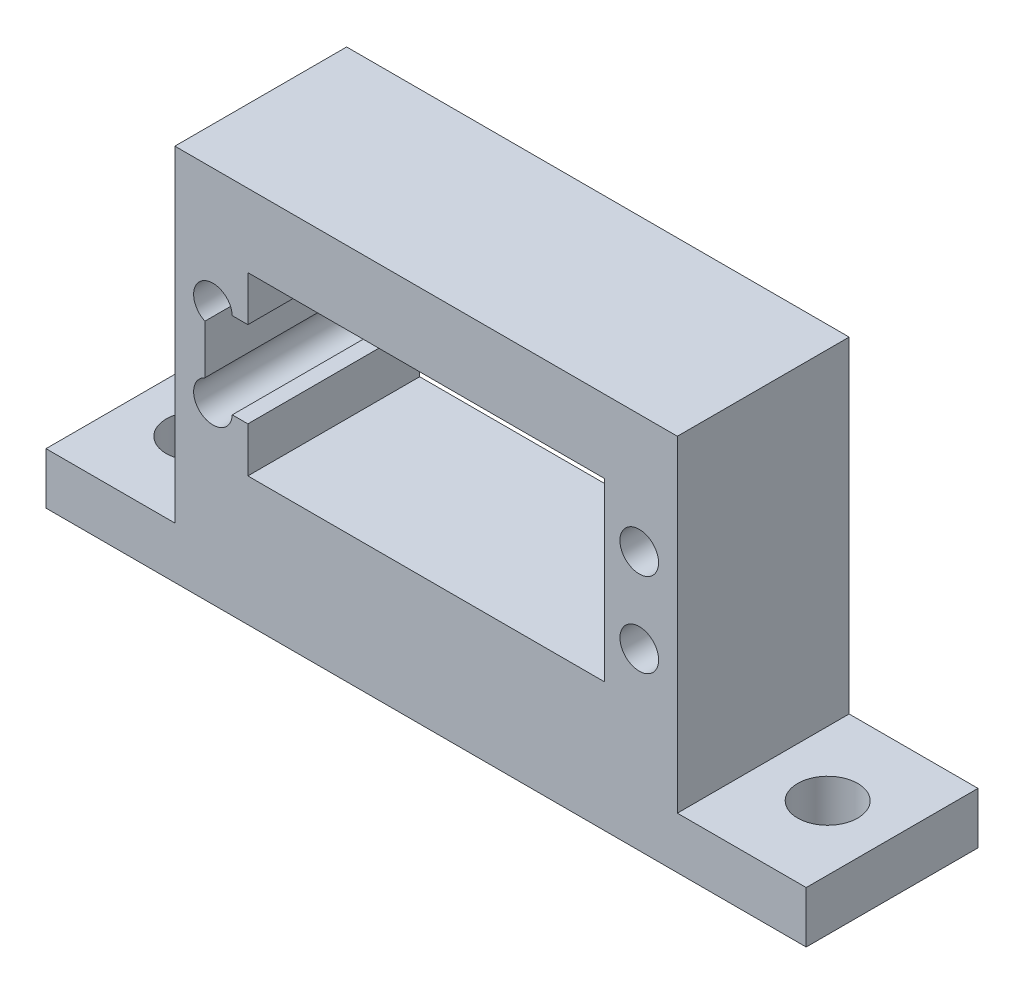
ISO-10303-21;
HEADER;
FILE_DESCRIPTION(('STEP AP214'),'2;1');
FILE_NAME('part.step','',(''),(''),'','','');
FILE_SCHEMA(('AUTOMOTIVE_DESIGN { 1 0 10303 214 1 1 1 1 }'));
ENDSEC;
DATA;
#1=APPLICATION_CONTEXT('core data for automotive mechanical design processes');
#2=APPLICATION_PROTOCOL_DEFINITION('international standard','automotive_design',2000,#1);
#3=PRODUCT_CONTEXT('',#1,'mechanical');
#4=PRODUCT('Part','Part','',(#3));
#5=PRODUCT_RELATED_PRODUCT_CATEGORY('part','',(#4));
#6=PRODUCT_DEFINITION_FORMATION('','',#4);
#7=PRODUCT_DEFINITION_CONTEXT('part definition',#1,'design');
#8=PRODUCT_DEFINITION('design','',#6,#7);
#9=PRODUCT_DEFINITION_SHAPE('','',#8);
#10=(LENGTH_UNIT() NAMED_UNIT(*) SI_UNIT(.MILLI.,.METRE.));
#11=(NAMED_UNIT(*) PLANE_ANGLE_UNIT() SI_UNIT($,.RADIAN.));
#12=(NAMED_UNIT(*) SI_UNIT($,.STERADIAN.) SOLID_ANGLE_UNIT());
#13=UNCERTAINTY_MEASURE_WITH_UNIT(LENGTH_MEASURE(1.E-05),#10,'distance_accuracy_value','');
#14=(GEOMETRIC_REPRESENTATION_CONTEXT(3) GLOBAL_UNCERTAINTY_ASSIGNED_CONTEXT((#13)) GLOBAL_UNIT_ASSIGNED_CONTEXT((#10,
#11,#12)) REPRESENTATION_CONTEXT('',''));
#15=CARTESIAN_POINT('',(0.,0.,0.));
#16=DIRECTION('',(0.,0.,1.));
#17=DIRECTION('',(1.,0.,0.));
#18=AXIS2_PLACEMENT_3D('',#15,#16,#17);
#19=CARTESIAN_POINT('',(0.,0.,20.));
#20=DIRECTION('',(0.,0.,1.));
#21=DIRECTION('',(1.,0.,0.));
#22=AXIS2_PLACEMENT_3D('',#19,#20,#21);
#23=PLANE('',#22);
#24=CARTESIAN_POINT('',(24.815,30.15,20.));
#25=DIRECTION('',(0.,0.,1.));
#26=DIRECTION('',(1.,0.,0.));
#27=AXIS2_PLACEMENT_3D('',#24,#25,#26);
#28=CIRCLE('',#27,2.25);
#29=CARTESIAN_POINT('',(27.065,30.15,20.));
#30=VERTEX_POINT('',#29);
#31=EDGE_CURVE('E204',#30,#30,#28,.T.);
#32=ORIENTED_EDGE('',*,*,#31,.F.);
#33=EDGE_LOOP('',(#32));
#34=FACE_BOUND('',#33,.T.);
#35=DIRECTION('',(0.,1.,0.));
#36=VECTOR('',#35,1.);
#37=CARTESIAN_POINT('',(44.25,0.,20.));
#38=LINE('',#37,#36);
#39=CARTESIAN_POINT('',(44.25,0.,20.));
#40=VERTEX_POINT('',#39);
#41=CARTESIAN_POINT('',(44.25,6.,20.));
#42=VERTEX_POINT('',#41);
#43=EDGE_CURVE('E244',#40,#42,#38,.T.);
#44=ORIENTED_EDGE('',*,*,#43,.T.);
#45=DIRECTION('',(-1.,0.,0.));
#46=VECTOR('',#45,1.);
#47=CARTESIAN_POINT('',(44.25,6.,20.));
#48=LINE('',#47,#46);
#49=CARTESIAN_POINT('',(29.25,5.99999999999999,20.));
#50=VERTEX_POINT('',#49);
#51=EDGE_CURVE('E247',#42,#50,#48,.T.);
#52=ORIENTED_EDGE('',*,*,#51,.T.);
#53=DIRECTION('',(0.,1.,0.));
#54=VECTOR('',#53,1.);
#55=CARTESIAN_POINT('',(29.25,5.99999999999999,20.));
#56=LINE('',#55,#54);
#57=CARTESIAN_POINT('',(29.25,44.,20.));
#58=VERTEX_POINT('',#57);
#59=EDGE_CURVE('E250',#50,#58,#56,.T.);
#60=ORIENTED_EDGE('',*,*,#59,.T.);
#61=DIRECTION('',(-1.,0.,0.));
#62=VECTOR('',#61,1.);
#63=CARTESIAN_POINT('',(29.25,44.,20.));
#64=LINE('',#63,#62);
#65=CARTESIAN_POINT('',(-29.25,44.,20.));
#66=VERTEX_POINT('',#65);
#67=EDGE_CURVE('E252',#58,#66,#64,.T.);
#68=ORIENTED_EDGE('',*,*,#67,.T.);
#69=DIRECTION('',(0.,-1.,0.));
#70=VECTOR('',#69,1.);
#71=CARTESIAN_POINT('',(-29.25,5.99999999999999,20.));
#72=LINE('',#71,#70);
#73=CARTESIAN_POINT('',(-29.25,5.99999999999999,20.));
#74=VERTEX_POINT('',#73);
#75=EDGE_CURVE('E254',#66,#74,#72,.T.);
#76=ORIENTED_EDGE('',*,*,#75,.T.);
#77=DIRECTION('',(-1.,0.,0.));
#78=VECTOR('',#77,1.);
#79=CARTESIAN_POINT('',(-44.25,6.,20.));
#80=LINE('',#79,#78);
#81=CARTESIAN_POINT('',(-44.25,6.,20.));
#82=VERTEX_POINT('',#81);
#83=EDGE_CURVE('E256',#74,#82,#80,.T.);
#84=ORIENTED_EDGE('',*,*,#83,.T.);
#85=DIRECTION('',(0.,-1.,0.));
#86=VECTOR('',#85,1.);
#87=CARTESIAN_POINT('',(-44.25,0.,20.));
#88=LINE('',#87,#86);
#89=CARTESIAN_POINT('',(-44.25,0.,20.));
#90=VERTEX_POINT('',#89);
#91=EDGE_CURVE('E258',#82,#90,#88,.T.);
#92=ORIENTED_EDGE('',*,*,#91,.T.);
#93=DIRECTION('',(1.,0.,0.));
#94=VECTOR('',#93,1.);
#95=CARTESIAN_POINT('',(-44.25,0.,20.));
#96=LINE('',#95,#94);
#97=EDGE_CURVE('E260',#90,#40,#96,.T.);
#98=ORIENTED_EDGE('',*,*,#97,.T.);
#99=EDGE_LOOP('',(#44,#52,#60,#68,#76,#84,#92,#98));
#100=FACE_BOUND('',#99,.T.);
#101=DIRECTION('',(-1.,0.,0.));
#102=VECTOR('',#101,1.);
#103=CARTESIAN_POINT('',(-20.75,30.25,20.));
#104=LINE('',#103,#102);
#105=CARTESIAN_POINT('',(-20.75,30.25,20.));
#106=VERTEX_POINT('',#105);
#107=CARTESIAN_POINT('',(-22.5672233207011,30.25,20.));
#108=VERTEX_POINT('',#107);
#109=EDGE_CURVE('E170',#106,#108,#104,.T.);
#110=ORIENTED_EDGE('',*,*,#109,.F.);
#111=DIRECTION('',(0.,-1.,0.));
#112=VECTOR('',#111,1.);
#113=CARTESIAN_POINT('',(-20.75,35.5,20.));
#114=LINE('',#113,#112);
#115=CARTESIAN_POINT('',(-20.75,35.5,20.));
#116=VERTEX_POINT('',#115);
#117=EDGE_CURVE('E162',#116,#106,#114,.T.);
#118=ORIENTED_EDGE('',*,*,#117,.F.);
#119=DIRECTION('',(-1.,0.,0.));
#120=VECTOR('',#119,1.);
#121=CARTESIAN_POINT('',(-20.75,35.5,20.));
#122=LINE('',#121,#120);
#123=CARTESIAN_POINT('',(20.75,35.5,20.));
#124=VERTEX_POINT('',#123);
#125=EDGE_CURVE('E201',#124,#116,#122,.T.);
#126=ORIENTED_EDGE('',*,*,#125,.F.);
#127=DIRECTION('',(0.,1.,0.));
#128=VECTOR('',#127,1.);
#129=CARTESIAN_POINT('',(20.75,35.5,20.));
#130=LINE('',#129,#128);
#131=CARTESIAN_POINT('',(20.75,15.,20.));
#132=VERTEX_POINT('',#131);
#133=EDGE_CURVE('E199',#132,#124,#130,.T.);
#134=ORIENTED_EDGE('',*,*,#133,.F.);
#135=DIRECTION('',(1.,0.,0.));
#136=VECTOR('',#135,1.);
#137=CARTESIAN_POINT('',(20.75,15.,20.));
#138=LINE('',#137,#136);
#139=CARTESIAN_POINT('',(-20.75,15.,20.));
#140=VERTEX_POINT('',#139);
#141=EDGE_CURVE('E197',#140,#132,#138,.T.);
#142=ORIENTED_EDGE('',*,*,#141,.F.);
#143=DIRECTION('',(0.,-1.,0.));
#144=VECTOR('',#143,1.);
#145=CARTESIAN_POINT('',(-20.75,20.25,20.));
#146=LINE('',#145,#144);
#147=CARTESIAN_POINT('',(-20.75,20.25,20.));
#148=VERTEX_POINT('',#147);
#149=EDGE_CURVE('E195',#148,#140,#146,.T.);
#150=ORIENTED_EDGE('',*,*,#149,.F.);
#151=DIRECTION('',(1.,0.,0.));
#152=VECTOR('',#151,1.);
#153=CARTESIAN_POINT('',(-22.5672233207011,20.25,20.));
#154=LINE('',#153,#152);
#155=CARTESIAN_POINT('',(-22.5672233207011,20.25,20.));
#156=VERTEX_POINT('',#155);
#157=EDGE_CURVE('E193',#156,#148,#154,.T.);
#158=ORIENTED_EDGE('',*,*,#157,.F.);
#159=CARTESIAN_POINT('',(-24.815,20.35,20.));
#160=DIRECTION('',(0.,0.,1.));
#161=DIRECTION('',(1.,0.,0.));
#162=AXIS2_PLACEMENT_3D('',#159,#160,#161);
#163=CIRCLE('',#162,2.25);
#164=CARTESIAN_POINT('',(-25.75,22.3965275468461,20.));
#165=VERTEX_POINT('',#164);
#166=EDGE_CURVE('E191',#165,#156,#163,.T.);
#167=ORIENTED_EDGE('',*,*,#166,.F.);
#168=DIRECTION('',(0.,-1.,0.));
#169=VECTOR('',#168,1.);
#170=CARTESIAN_POINT('',(-25.75,28.1034724531539,20.));
#171=LINE('',#170,#169);
#172=CARTESIAN_POINT('',(-25.75,28.1034724531539,20.));
#173=VERTEX_POINT('',#172);
#174=EDGE_CURVE('E186',#173,#165,#171,.T.);
#175=ORIENTED_EDGE('',*,*,#174,.F.);
#176=CARTESIAN_POINT('',(-24.815,30.15,20.));
#177=DIRECTION('',(0.,0.,1.));
#178=DIRECTION('',(-1.,0.,0.));
#179=AXIS2_PLACEMENT_3D('',#176,#177,#178);
#180=CIRCLE('',#179,2.25);
#181=EDGE_CURVE('E184',#108,#173,#180,.T.);
#182=ORIENTED_EDGE('',*,*,#181,.F.);
#183=EDGE_LOOP('',(#110,#118,#126,#134,#142,#150,#158,#167,#175,#182));
#184=FACE_BOUND('',#183,.T.);
#185=CARTESIAN_POINT('',(24.815,20.35,20.));
#186=DIRECTION('',(0.,0.,1.));
#187=DIRECTION('',(-1.,0.,0.));
#188=AXIS2_PLACEMENT_3D('',#185,#186,#187);
#189=CIRCLE('',#188,2.25);
#190=CARTESIAN_POINT('',(22.565,20.35,20.));
#191=VERTEX_POINT('',#190);
#192=EDGE_CURVE('E377',#191,#191,#189,.T.);
#193=ORIENTED_EDGE('',*,*,#192,.F.);
#194=EDGE_LOOP('',(#193));
#195=FACE_BOUND('',#194,.T.);
#196=ADVANCED_FACE('F37',(#34,#100,#184,#195),#23,.T.);
#197=CARTESIAN_POINT('',(0.,0.,0.));
#198=DIRECTION('',(0.,0.,1.));
#199=DIRECTION('',(1.,0.,0.));
#200=AXIS2_PLACEMENT_3D('',#197,#198,#199);
#201=PLANE('',#200);
#202=DIRECTION('',(0.,1.,0.));
#203=VECTOR('',#202,1.);
#204=CARTESIAN_POINT('',(44.25,0.,0.));
#205=LINE('',#204,#203);
#206=CARTESIAN_POINT('',(44.25,0.,0.));
#207=VERTEX_POINT('',#206);
#208=CARTESIAN_POINT('',(44.25,6.,0.));
#209=VERTEX_POINT('',#208);
#210=EDGE_CURVE('E178',#207,#209,#205,.T.);
#211=ORIENTED_EDGE('',*,*,#210,.F.);
#212=DIRECTION('',(1.,0.,0.));
#213=VECTOR('',#212,1.);
#214=CARTESIAN_POINT('',(-44.25,0.,0.));
#215=LINE('',#214,#213);
#216=CARTESIAN_POINT('',(-44.25,0.,0.));
#217=VERTEX_POINT('',#216);
#218=EDGE_CURVE('E248',#217,#207,#215,.T.);
#219=ORIENTED_EDGE('',*,*,#218,.F.);
#220=DIRECTION('',(0.,-1.,0.));
#221=VECTOR('',#220,1.);
#222=CARTESIAN_POINT('',(-44.25,0.,0.));
#223=LINE('',#222,#221);
#224=CARTESIAN_POINT('',(-44.25,6.,0.));
#225=VERTEX_POINT('',#224);
#226=EDGE_CURVE('E275',#225,#217,#223,.T.);
#227=ORIENTED_EDGE('',*,*,#226,.F.);
#228=DIRECTION('',(-1.,0.,0.));
#229=VECTOR('',#228,1.);
#230=CARTESIAN_POINT('',(-44.25,6.,0.));
#231=LINE('',#230,#229);
#232=CARTESIAN_POINT('',(-29.25,5.99999999999999,0.));
#233=VERTEX_POINT('',#232);
#234=EDGE_CURVE('E273',#233,#225,#231,.T.);
#235=ORIENTED_EDGE('',*,*,#234,.F.);
#236=DIRECTION('',(0.,-1.,0.));
#237=VECTOR('',#236,1.);
#238=CARTESIAN_POINT('',(-29.25,5.99999999999999,0.));
#239=LINE('',#238,#237);
#240=CARTESIAN_POINT('',(-29.25,44.,0.));
#241=VERTEX_POINT('',#240);
#242=EDGE_CURVE('E271',#241,#233,#239,.T.);
#243=ORIENTED_EDGE('',*,*,#242,.F.);
#244=DIRECTION('',(-1.,0.,0.));
#245=VECTOR('',#244,1.);
#246=CARTESIAN_POINT('',(29.25,44.,0.));
#247=LINE('',#246,#245);
#248=CARTESIAN_POINT('',(29.25,44.,0.));
#249=VERTEX_POINT('',#248);
#250=EDGE_CURVE('E269',#249,#241,#247,.T.);
#251=ORIENTED_EDGE('',*,*,#250,.F.);
#252=DIRECTION('',(0.,1.,0.));
#253=VECTOR('',#252,1.);
#254=CARTESIAN_POINT('',(29.25,5.99999999999999,0.));
#255=LINE('',#254,#253);
#256=CARTESIAN_POINT('',(29.25,5.99999999999999,0.));
#257=VERTEX_POINT('',#256);
#258=EDGE_CURVE('E267',#257,#249,#255,.T.);
#259=ORIENTED_EDGE('',*,*,#258,.F.);
#260=DIRECTION('',(-1.,0.,0.));
#261=VECTOR('',#260,1.);
#262=CARTESIAN_POINT('',(44.25,6.,0.));
#263=LINE('',#262,#261);
#264=EDGE_CURVE('E265',#209,#257,#263,.T.);
#265=ORIENTED_EDGE('',*,*,#264,.F.);
#266=EDGE_LOOP('',(#211,#219,#227,#235,#243,#251,#259,#265));
#267=FACE_BOUND('',#266,.T.);
#268=DIRECTION('',(0.,-1.,0.));
#269=VECTOR('',#268,1.);
#270=CARTESIAN_POINT('',(-20.75,35.5,0.));
#271=LINE('',#270,#269);
#272=CARTESIAN_POINT('',(-20.75,35.5,0.));
#273=VERTEX_POINT('',#272);
#274=CARTESIAN_POINT('',(-20.75,30.25,0.));
#275=VERTEX_POINT('',#274);
#276=EDGE_CURVE('E60',#273,#275,#271,.T.);
#277=ORIENTED_EDGE('',*,*,#276,.T.);
#278=DIRECTION('',(-1.,0.,0.));
#279=VECTOR('',#278,1.);
#280=CARTESIAN_POINT('',(-20.75,30.25,0.));
#281=LINE('',#280,#279);
#282=CARTESIAN_POINT('',(-22.5672233207011,30.25,0.));
#283=VERTEX_POINT('',#282);
#284=EDGE_CURVE('E177',#275,#283,#281,.T.);
#285=ORIENTED_EDGE('',*,*,#284,.T.);
#286=CARTESIAN_POINT('',(-24.815,30.15,0.));
#287=DIRECTION('',(0.,0.,1.));
#288=DIRECTION('',(-1.,0.,0.));
#289=AXIS2_PLACEMENT_3D('',#286,#287,#288);
#290=CIRCLE('',#289,2.25);
#291=CARTESIAN_POINT('',(-25.75,28.1034724531539,0.));
#292=VERTEX_POINT('',#291);
#293=EDGE_CURVE('E206',#283,#292,#290,.T.);
#294=ORIENTED_EDGE('',*,*,#293,.T.);
#295=DIRECTION('',(0.,-1.,0.));
#296=VECTOR('',#295,1.);
#297=CARTESIAN_POINT('',(-25.75,28.1034724531539,0.));
#298=LINE('',#297,#296);
#299=CARTESIAN_POINT('',(-25.75,22.3965275468461,0.));
#300=VERTEX_POINT('',#299);
#301=EDGE_CURVE('E209',#292,#300,#298,.T.);
#302=ORIENTED_EDGE('',*,*,#301,.T.);
#303=CARTESIAN_POINT('',(-24.815,20.35,0.));
#304=DIRECTION('',(0.,0.,1.));
#305=DIRECTION('',(1.,0.,0.));
#306=AXIS2_PLACEMENT_3D('',#303,#304,#305);
#307=CIRCLE('',#306,2.25);
#308=CARTESIAN_POINT('',(-22.5672233207011,20.25,0.));
#309=VERTEX_POINT('',#308);
#310=EDGE_CURVE('E212',#300,#309,#307,.T.);
#311=ORIENTED_EDGE('',*,*,#310,.T.);
#312=DIRECTION('',(1.,0.,0.));
#313=VECTOR('',#312,1.);
#314=CARTESIAN_POINT('',(-22.5672233207011,20.25,0.));
#315=LINE('',#314,#313);
#316=CARTESIAN_POINT('',(-20.75,20.25,0.));
#317=VERTEX_POINT('',#316);
#318=EDGE_CURVE('E215',#309,#317,#315,.T.);
#319=ORIENTED_EDGE('',*,*,#318,.T.);
#320=DIRECTION('',(0.,-1.,0.));
#321=VECTOR('',#320,1.);
#322=CARTESIAN_POINT('',(-20.75,20.25,0.));
#323=LINE('',#322,#321);
#324=CARTESIAN_POINT('',(-20.75,15.,0.));
#325=VERTEX_POINT('',#324);
#326=EDGE_CURVE('E218',#317,#325,#323,.T.);
#327=ORIENTED_EDGE('',*,*,#326,.T.);
#328=DIRECTION('',(1.,0.,0.));
#329=VECTOR('',#328,1.);
#330=CARTESIAN_POINT('',(20.75,15.,0.));
#331=LINE('',#330,#329);
#332=CARTESIAN_POINT('',(20.75,15.,0.));
#333=VERTEX_POINT('',#332);
#334=EDGE_CURVE('E221',#325,#333,#331,.T.);
#335=ORIENTED_EDGE('',*,*,#334,.T.);
#336=DIRECTION('',(0.,1.,0.));
#337=VECTOR('',#336,1.);
#338=CARTESIAN_POINT('',(20.75,35.5,0.));
#339=LINE('',#338,#337);
#340=CARTESIAN_POINT('',(20.75,35.5,0.));
#341=VERTEX_POINT('',#340);
#342=EDGE_CURVE('E224',#333,#341,#339,.T.);
#343=ORIENTED_EDGE('',*,*,#342,.T.);
#344=DIRECTION('',(-1.,0.,0.));
#345=VECTOR('',#344,1.);
#346=CARTESIAN_POINT('',(-20.75,35.5,0.));
#347=LINE('',#346,#345);
#348=EDGE_CURVE('E171',#341,#273,#347,.T.);
#349=ORIENTED_EDGE('',*,*,#348,.T.);
#350=EDGE_LOOP('',(#277,#285,#294,#302,#311,#319,#327,#335,#343,#349));
#351=FACE_BOUND('',#350,.T.);
#352=CARTESIAN_POINT('',(24.815,30.15,0.));
#353=DIRECTION('',(0.,0.,1.));
#354=DIRECTION('',(1.,0.,0.));
#355=AXIS2_PLACEMENT_3D('',#352,#353,#354);
#356=CIRCLE('',#355,2.25);
#357=CARTESIAN_POINT('',(27.065,30.15,0.));
#358=VERTEX_POINT('',#357);
#359=EDGE_CURVE('E380',#358,#358,#356,.T.);
#360=ORIENTED_EDGE('',*,*,#359,.T.);
#361=EDGE_LOOP('',(#360));
#362=FACE_BOUND('',#361,.T.);
#363=CARTESIAN_POINT('',(24.815,20.35,0.));
#364=DIRECTION('',(0.,0.,1.));
#365=DIRECTION('',(-1.,0.,0.));
#366=AXIS2_PLACEMENT_3D('',#363,#364,#365);
#367=CIRCLE('',#366,2.25);
#368=CARTESIAN_POINT('',(22.565,20.35,0.));
#369=VERTEX_POINT('',#368);
#370=EDGE_CURVE('E381',#369,#369,#367,.T.);
#371=ORIENTED_EDGE('',*,*,#370,.T.);
#372=EDGE_LOOP('',(#371));
#373=FACE_BOUND('',#372,.T.);
#374=ADVANCED_FACE('F305',(#267,#351,#362,#373),#201,.F.);
#375=CARTESIAN_POINT('',(44.25,0.,20.));
#376=DIRECTION('',(-1.,0.,0.));
#377=DIRECTION('',(0.,-1.,0.));
#378=AXIS2_PLACEMENT_3D('',#375,#376,#377);
#379=PLANE('',#378);
#380=ORIENTED_EDGE('',*,*,#210,.T.);
#381=DIRECTION('',(0.,0.,-1.));
#382=VECTOR('',#381,1.);
#383=CARTESIAN_POINT('',(44.25,6.,20.));
#384=LINE('',#383,#382);
#385=EDGE_CURVE('E11',#42,#209,#384,.T.);
#386=ORIENTED_EDGE('',*,*,#385,.F.);
#387=ORIENTED_EDGE('',*,*,#43,.F.);
#388=DIRECTION('',(0.,0.,-1.));
#389=VECTOR('',#388,1.);
#390=CARTESIAN_POINT('',(44.25,0.,20.));
#391=LINE('',#390,#389);
#392=EDGE_CURVE('E262',#40,#207,#391,.T.);
#393=ORIENTED_EDGE('',*,*,#392,.T.);
#394=EDGE_LOOP('',(#380,#386,#387,#393));
#395=FACE_BOUND('',#394,.T.);
#396=ADVANCED_FACE('F39',(#395),#379,.F.);
#397=CARTESIAN_POINT('',(44.25,6.,20.));
#398=DIRECTION('',(0.,-1.,0.));
#399=DIRECTION('',(1.,0.,0.));
#400=AXIS2_PLACEMENT_3D('',#397,#398,#399);
#401=PLANE('',#400);
#402=CARTESIAN_POINT('',(36.75,5.99999999999999,10.));
#403=DIRECTION('',(0.,1.,0.));
#404=DIRECTION('',(-1.,0.,0.));
#405=AXIS2_PLACEMENT_3D('',#402,#403,#404);
#406=CIRCLE('',#405,3.5);
#407=CARTESIAN_POINT('',(33.25,5.99999999999999,10.));
#408=VERTEX_POINT('',#407);
#409=EDGE_CURVE('E373',#408,#408,#406,.T.);
#410=ORIENTED_EDGE('',*,*,#409,.F.);
#411=EDGE_LOOP('',(#410));
#412=FACE_BOUND('',#411,.T.);
#413=ORIENTED_EDGE('',*,*,#264,.T.);
#414=DIRECTION('',(0.,0.,-1.));
#415=VECTOR('',#414,1.);
#416=CARTESIAN_POINT('',(29.25,5.99999999999999,20.));
#417=LINE('',#416,#415);
#418=EDGE_CURVE('E45',#50,#257,#417,.T.);
#419=ORIENTED_EDGE('',*,*,#418,.F.);
#420=ORIENTED_EDGE('',*,*,#51,.F.);
#421=ORIENTED_EDGE('',*,*,#385,.T.);
#422=EDGE_LOOP('',(#413,#419,#420,#421));
#423=FACE_BOUND('',#422,.T.);
#424=ADVANCED_FACE('F322',(#412,#423),#401,.F.);
#425=CARTESIAN_POINT('',(29.25,5.99999999999999,20.));
#426=DIRECTION('',(-1.,0.,0.));
#427=DIRECTION('',(0.,-1.,0.));
#428=AXIS2_PLACEMENT_3D('',#425,#426,#427);
#429=PLANE('',#428);
#430=ORIENTED_EDGE('',*,*,#258,.T.);
#431=DIRECTION('',(0.,0.,-1.));
#432=VECTOR('',#431,1.);
#433=CARTESIAN_POINT('',(29.25,44.,20.));
#434=LINE('',#433,#432);
#435=EDGE_CURVE('E292',#58,#249,#434,.T.);
#436=ORIENTED_EDGE('',*,*,#435,.F.);
#437=ORIENTED_EDGE('',*,*,#59,.F.);
#438=ORIENTED_EDGE('',*,*,#418,.T.);
#439=EDGE_LOOP('',(#430,#436,#437,#438));
#440=FACE_BOUND('',#439,.T.);
#441=ADVANCED_FACE('F299',(#440),#429,.F.);
#442=CARTESIAN_POINT('',(29.25,44.,20.));
#443=DIRECTION('',(0.,-1.,0.));
#444=DIRECTION('',(0.,0.,-1.));
#445=AXIS2_PLACEMENT_3D('',#442,#443,#444);
#446=PLANE('',#445);
#447=ORIENTED_EDGE('',*,*,#250,.T.);
#448=DIRECTION('',(0.,0.,-1.));
#449=VECTOR('',#448,1.);
#450=CARTESIAN_POINT('',(-29.25,44.,20.));
#451=LINE('',#450,#449);
#452=EDGE_CURVE('E289',#66,#241,#451,.T.);
#453=ORIENTED_EDGE('',*,*,#452,.F.);
#454=ORIENTED_EDGE('',*,*,#67,.F.);
#455=ORIENTED_EDGE('',*,*,#435,.T.);
#456=EDGE_LOOP('',(#447,#453,#454,#455));
#457=FACE_BOUND('',#456,.T.);
#458=ADVANCED_FACE('F311',(#457),#446,.F.);
#459=CARTESIAN_POINT('',(-29.25,5.99999999999999,20.));
#460=DIRECTION('',(1.,0.,0.));
#461=DIRECTION('',(0.,1.,0.));
#462=AXIS2_PLACEMENT_3D('',#459,#460,#461);
#463=PLANE('',#462);
#464=ORIENTED_EDGE('',*,*,#242,.T.);
#465=DIRECTION('',(0.,0.,-1.));
#466=VECTOR('',#465,1.);
#467=CARTESIAN_POINT('',(-29.25,5.99999999999999,20.));
#468=LINE('',#467,#466);
#469=EDGE_CURVE('E286',#74,#233,#468,.T.);
#470=ORIENTED_EDGE('',*,*,#469,.F.);
#471=ORIENTED_EDGE('',*,*,#75,.F.);
#472=ORIENTED_EDGE('',*,*,#452,.T.);
#473=EDGE_LOOP('',(#464,#470,#471,#472));
#474=FACE_BOUND('',#473,.T.);
#475=ADVANCED_FACE('F315',(#474),#463,.F.);
#476=CARTESIAN_POINT('',(-44.25,6.,20.));
#477=DIRECTION('',(0.,-1.,0.));
#478=DIRECTION('',(1.,0.,0.));
#479=AXIS2_PLACEMENT_3D('',#476,#477,#478);
#480=PLANE('',#479);
#481=CARTESIAN_POINT('',(-36.75,5.99999999999998,10.));
#482=DIRECTION('',(0.,1.,0.));
#483=DIRECTION('',(1.,0.,0.));
#484=AXIS2_PLACEMENT_3D('',#481,#482,#483);
#485=CIRCLE('',#484,3.5);
#486=CARTESIAN_POINT('',(-33.25,5.99999999999998,10.));
#487=VERTEX_POINT('',#486);
#488=EDGE_CURVE('E370',#487,#487,#485,.T.);
#489=ORIENTED_EDGE('',*,*,#488,.F.);
#490=EDGE_LOOP('',(#489));
#491=FACE_BOUND('',#490,.T.);
#492=ORIENTED_EDGE('',*,*,#234,.T.);
#493=DIRECTION('',(0.,0.,-1.));
#494=VECTOR('',#493,1.);
#495=CARTESIAN_POINT('',(-44.25,6.,20.));
#496=LINE('',#495,#494);
#497=EDGE_CURVE('E283',#82,#225,#496,.T.);
#498=ORIENTED_EDGE('',*,*,#497,.F.);
#499=ORIENTED_EDGE('',*,*,#83,.F.);
#500=ORIENTED_EDGE('',*,*,#469,.T.);
#501=EDGE_LOOP('',(#492,#498,#499,#500));
#502=FACE_BOUND('',#501,.T.);
#503=ADVANCED_FACE('F335',(#491,#502),#480,.F.);
#504=CARTESIAN_POINT('',(-44.25,0.,20.));
#505=DIRECTION('',(1.,0.,0.));
#506=DIRECTION('',(0.,1.,0.));
#507=AXIS2_PLACEMENT_3D('',#504,#505,#506);
#508=PLANE('',#507);
#509=ORIENTED_EDGE('',*,*,#226,.T.);
#510=DIRECTION('',(0.,0.,-1.));
#511=VECTOR('',#510,1.);
#512=CARTESIAN_POINT('',(-44.25,0.,20.));
#513=LINE('',#512,#511);
#514=EDGE_CURVE('E280',#90,#217,#513,.T.);
#515=ORIENTED_EDGE('',*,*,#514,.F.);
#516=ORIENTED_EDGE('',*,*,#91,.F.);
#517=ORIENTED_EDGE('',*,*,#497,.T.);
#518=EDGE_LOOP('',(#509,#515,#516,#517));
#519=FACE_BOUND('',#518,.T.);
#520=ADVANCED_FACE('F333',(#519),#508,.F.);
#521=CARTESIAN_POINT('',(-44.25,0.,20.));
#522=DIRECTION('',(0.,1.,0.));
#523=DIRECTION('',(-1.,0.,0.));
#524=AXIS2_PLACEMENT_3D('',#521,#522,#523);
#525=PLANE('',#524);
#526=CARTESIAN_POINT('',(36.75,0.,10.));
#527=DIRECTION('',(0.,1.,0.));
#528=DIRECTION('',(-1.,0.,0.));
#529=AXIS2_PLACEMENT_3D('',#526,#527,#528);
#530=CIRCLE('',#529,3.5);
#531=CARTESIAN_POINT('',(33.25,0.,10.));
#532=VERTEX_POINT('',#531);
#533=EDGE_CURVE('E365',#532,#532,#530,.T.);
#534=ORIENTED_EDGE('',*,*,#533,.T.);
#535=EDGE_LOOP('',(#534));
#536=FACE_BOUND('',#535,.T.);
#537=CARTESIAN_POINT('',(-36.75,0.,10.));
#538=DIRECTION('',(0.,1.,0.));
#539=DIRECTION('',(1.,0.,0.));
#540=AXIS2_PLACEMENT_3D('',#537,#538,#539);
#541=CIRCLE('',#540,3.5);
#542=CARTESIAN_POINT('',(-33.25,0.,10.));
#543=VERTEX_POINT('',#542);
#544=EDGE_CURVE('E368',#543,#543,#541,.T.);
#545=ORIENTED_EDGE('',*,*,#544,.T.);
#546=EDGE_LOOP('',(#545));
#547=FACE_BOUND('',#546,.T.);
#548=ORIENTED_EDGE('',*,*,#218,.T.);
#549=ORIENTED_EDGE('',*,*,#392,.F.);
#550=ORIENTED_EDGE('',*,*,#97,.F.);
#551=ORIENTED_EDGE('',*,*,#514,.T.);
#552=EDGE_LOOP('',(#548,#549,#550,#551));
#553=FACE_BOUND('',#552,.T.);
#554=ADVANCED_FACE('F328',(#536,#547,#553),#525,.F.);
#555=CARTESIAN_POINT('',(-20.75,35.5,20.));
#556=DIRECTION('',(1.,0.,0.));
#557=DIRECTION('',(0.,1.,0.));
#558=AXIS2_PLACEMENT_3D('',#555,#556,#557);
#559=PLANE('',#558);
#560=ORIENTED_EDGE('',*,*,#276,.F.);
#561=DIRECTION('',(0.,0.,-1.));
#562=VECTOR('',#561,1.);
#563=CARTESIAN_POINT('',(-20.75,35.5,20.));
#564=LINE('',#563,#562);
#565=EDGE_CURVE('E166',#116,#273,#564,.T.);
#566=ORIENTED_EDGE('',*,*,#565,.F.);
#567=ORIENTED_EDGE('',*,*,#117,.T.);
#568=DIRECTION('',(0.,0.,-1.));
#569=VECTOR('',#568,1.);
#570=CARTESIAN_POINT('',(-20.75,30.25,20.));
#571=LINE('',#570,#569);
#572=EDGE_CURVE('E165',#106,#275,#571,.T.);
#573=ORIENTED_EDGE('',*,*,#572,.T.);
#574=EDGE_LOOP('',(#560,#566,#567,#573));
#575=FACE_BOUND('',#574,.T.);
#576=ADVANCED_FACE('F164',(#575),#559,.T.);
#577=CARTESIAN_POINT('',(-20.75,30.25,20.));
#578=DIRECTION('',(0.,-1.,0.));
#579=DIRECTION('',(0.,0.,-1.));
#580=AXIS2_PLACEMENT_3D('',#577,#578,#579);
#581=PLANE('',#580);
#582=ORIENTED_EDGE('',*,*,#284,.F.);
#583=ORIENTED_EDGE('',*,*,#572,.F.);
#584=ORIENTED_EDGE('',*,*,#109,.T.);
#585=DIRECTION('',(0.,0.,-1.));
#586=VECTOR('',#585,1.);
#587=CARTESIAN_POINT('',(-22.5672233207011,30.25,20.));
#588=LINE('',#587,#586);
#589=EDGE_CURVE('E179',#108,#283,#588,.T.);
#590=ORIENTED_EDGE('',*,*,#589,.T.);
#591=EDGE_LOOP('',(#582,#583,#584,#590));
#592=FACE_BOUND('',#591,.T.);
#593=ADVANCED_FACE('F174',(#592),#581,.T.);
#594=CARTESIAN_POINT('',(-24.815,30.15,20.));
#595=DIRECTION('',(0.,0.,-1.));
#596=DIRECTION('',(-1.,0.,0.));
#597=AXIS2_PLACEMENT_3D('',#594,#595,#596);
#598=CYLINDRICAL_SURFACE('',#597,2.25);
#599=ORIENTED_EDGE('',*,*,#293,.F.);
#600=ORIENTED_EDGE('',*,*,#589,.F.);
#601=ORIENTED_EDGE('',*,*,#181,.T.);
#602=DIRECTION('',(0.,0.,-1.));
#603=VECTOR('',#602,1.);
#604=CARTESIAN_POINT('',(-25.75,28.1034724531539,20.));
#605=LINE('',#604,#603);
#606=EDGE_CURVE('E241',#173,#292,#605,.T.);
#607=ORIENTED_EDGE('',*,*,#606,.T.);
#608=EDGE_LOOP('',(#599,#600,#601,#607));
#609=FACE_BOUND('',#608,.T.);
#610=ADVANCED_FACE('F429',(#609),#598,.F.);
#611=CARTESIAN_POINT('',(-25.75,28.1034724531539,20.));
#612=DIRECTION('',(1.,0.,0.));
#613=DIRECTION('',(0.,0.,-1.));
#614=AXIS2_PLACEMENT_3D('',#611,#612,#613);
#615=PLANE('',#614);
#616=ORIENTED_EDGE('',*,*,#301,.F.);
#617=ORIENTED_EDGE('',*,*,#606,.F.);
#618=ORIENTED_EDGE('',*,*,#174,.T.);
#619=DIRECTION('',(0.,0.,-1.));
#620=VECTOR('',#619,1.);
#621=CARTESIAN_POINT('',(-25.75,22.3965275468461,20.));
#622=LINE('',#621,#620);
#623=EDGE_CURVE('E239',#165,#300,#622,.T.);
#624=ORIENTED_EDGE('',*,*,#623,.T.);
#625=EDGE_LOOP('',(#616,#617,#618,#624));
#626=FACE_BOUND('',#625,.T.);
#627=ADVANCED_FACE('F425',(#626),#615,.T.);
#628=CARTESIAN_POINT('',(-24.815,20.35,20.));
#629=DIRECTION('',(0.,0.,-1.));
#630=DIRECTION('',(-1.,0.,0.));
#631=AXIS2_PLACEMENT_3D('',#628,#629,#630);
#632=CYLINDRICAL_SURFACE('',#631,2.25);
#633=ORIENTED_EDGE('',*,*,#310,.F.);
#634=ORIENTED_EDGE('',*,*,#623,.F.);
#635=ORIENTED_EDGE('',*,*,#166,.T.);
#636=DIRECTION('',(0.,0.,-1.));
#637=VECTOR('',#636,1.);
#638=CARTESIAN_POINT('',(-22.5672233207011,20.25,20.));
#639=LINE('',#638,#637);
#640=EDGE_CURVE('E237',#156,#309,#639,.T.);
#641=ORIENTED_EDGE('',*,*,#640,.T.);
#642=EDGE_LOOP('',(#633,#634,#635,#641));
#643=FACE_BOUND('',#642,.T.);
#644=ADVANCED_FACE('F421',(#643),#632,.F.);
#645=CARTESIAN_POINT('',(-22.5672233207011,20.25,20.));
#646=DIRECTION('',(0.,1.,0.));
#647=DIRECTION('',(0.,0.,1.));
#648=AXIS2_PLACEMENT_3D('',#645,#646,#647);
#649=PLANE('',#648);
#650=ORIENTED_EDGE('',*,*,#318,.F.);
#651=ORIENTED_EDGE('',*,*,#640,.F.);
#652=ORIENTED_EDGE('',*,*,#157,.T.);
#653=DIRECTION('',(0.,0.,-1.));
#654=VECTOR('',#653,1.);
#655=CARTESIAN_POINT('',(-20.75,20.25,20.));
#656=LINE('',#655,#654);
#657=EDGE_CURVE('E235',#148,#317,#656,.T.);
#658=ORIENTED_EDGE('',*,*,#657,.T.);
#659=EDGE_LOOP('',(#650,#651,#652,#658));
#660=FACE_BOUND('',#659,.T.);
#661=ADVANCED_FACE('F417',(#660),#649,.T.);
#662=CARTESIAN_POINT('',(-20.75,20.25,20.));
#663=DIRECTION('',(1.,0.,0.));
#664=DIRECTION('',(0.,1.,0.));
#665=AXIS2_PLACEMENT_3D('',#662,#663,#664);
#666=PLANE('',#665);
#667=ORIENTED_EDGE('',*,*,#326,.F.);
#668=ORIENTED_EDGE('',*,*,#657,.F.);
#669=ORIENTED_EDGE('',*,*,#149,.T.);
#670=DIRECTION('',(0.,0.,-1.));
#671=VECTOR('',#670,1.);
#672=CARTESIAN_POINT('',(-20.75,15.,20.));
#673=LINE('',#672,#671);
#674=EDGE_CURVE('E233',#140,#325,#673,.T.);
#675=ORIENTED_EDGE('',*,*,#674,.T.);
#676=EDGE_LOOP('',(#667,#668,#669,#675));
#677=FACE_BOUND('',#676,.T.);
#678=ADVANCED_FACE('F413',(#677),#666,.T.);
#679=CARTESIAN_POINT('',(20.75,15.,20.));
#680=DIRECTION('',(0.,1.,0.));
#681=DIRECTION('',(0.,0.,1.));
#682=AXIS2_PLACEMENT_3D('',#679,#680,#681);
#683=PLANE('',#682);
#684=ORIENTED_EDGE('',*,*,#334,.F.);
#685=ORIENTED_EDGE('',*,*,#674,.F.);
#686=ORIENTED_EDGE('',*,*,#141,.T.);
#687=DIRECTION('',(0.,0.,-1.));
#688=VECTOR('',#687,1.);
#689=CARTESIAN_POINT('',(20.75,15.,20.));
#690=LINE('',#689,#688);
#691=EDGE_CURVE('E231',#132,#333,#690,.T.);
#692=ORIENTED_EDGE('',*,*,#691,.T.);
#693=EDGE_LOOP('',(#684,#685,#686,#692));
#694=FACE_BOUND('',#693,.T.);
#695=ADVANCED_FACE('F409',(#694),#683,.T.);
#696=CARTESIAN_POINT('',(20.75,35.5,20.));
#697=DIRECTION('',(-1.,0.,0.));
#698=DIRECTION('',(0.,-1.,0.));
#699=AXIS2_PLACEMENT_3D('',#696,#697,#698);
#700=PLANE('',#699);
#701=ORIENTED_EDGE('',*,*,#342,.F.);
#702=ORIENTED_EDGE('',*,*,#691,.F.);
#703=ORIENTED_EDGE('',*,*,#133,.T.);
#704=DIRECTION('',(0.,0.,-1.));
#705=VECTOR('',#704,1.);
#706=CARTESIAN_POINT('',(20.75,35.5,20.));
#707=LINE('',#706,#705);
#708=EDGE_CURVE('E52',#124,#341,#707,.T.);
#709=ORIENTED_EDGE('',*,*,#708,.T.);
#710=EDGE_LOOP('',(#701,#702,#703,#709));
#711=FACE_BOUND('',#710,.T.);
#712=ADVANCED_FACE('F403',(#711),#700,.T.);
#713=CARTESIAN_POINT('',(-20.75,35.5,20.));
#714=DIRECTION('',(0.,-1.,0.));
#715=DIRECTION('',(0.,0.,-1.));
#716=AXIS2_PLACEMENT_3D('',#713,#714,#715);
#717=PLANE('',#716);
#718=ORIENTED_EDGE('',*,*,#348,.F.);
#719=ORIENTED_EDGE('',*,*,#708,.F.);
#720=ORIENTED_EDGE('',*,*,#125,.T.);
#721=ORIENTED_EDGE('',*,*,#565,.T.);
#722=EDGE_LOOP('',(#718,#719,#720,#721));
#723=FACE_BOUND('',#722,.T.);
#724=ADVANCED_FACE('F393',(#723),#717,.T.);
#725=CARTESIAN_POINT('',(24.815,30.15,20.));
#726=DIRECTION('',(0.,0.,-1.));
#727=DIRECTION('',(-1.,0.,0.));
#728=AXIS2_PLACEMENT_3D('',#725,#726,#727);
#729=CYLINDRICAL_SURFACE('',#728,2.25);
#730=ORIENTED_EDGE('',*,*,#31,.T.);
#731=EDGE_LOOP('',(#730));
#732=FACE_BOUND('',#731,.T.);
#733=ORIENTED_EDGE('',*,*,#359,.F.);
#734=EDGE_LOOP('',(#733));
#735=FACE_BOUND('',#734,.T.);
#736=ADVANCED_FACE('F390',(#732,#735),#729,.F.);
#737=CARTESIAN_POINT('',(24.815,20.35,20.));
#738=DIRECTION('',(0.,0.,-1.));
#739=DIRECTION('',(-1.,0.,0.));
#740=AXIS2_PLACEMENT_3D('',#737,#738,#739);
#741=CYLINDRICAL_SURFACE('',#740,2.25);
#742=ORIENTED_EDGE('',*,*,#192,.T.);
#743=EDGE_LOOP('',(#742));
#744=FACE_BOUND('',#743,.T.);
#745=ORIENTED_EDGE('',*,*,#370,.F.);
#746=EDGE_LOOP('',(#745));
#747=FACE_BOUND('',#746,.T.);
#748=ADVANCED_FACE('F392',(#744,#747),#741,.F.);
#749=CARTESIAN_POINT('',(-36.75,0.,10.));
#750=DIRECTION('',(0.,1.,0.));
#751=DIRECTION('',(-1.,0.,0.));
#752=AXIS2_PLACEMENT_3D('',#749,#750,#751);
#753=CYLINDRICAL_SURFACE('',#752,3.5);
#754=ORIENTED_EDGE('',*,*,#544,.F.);
#755=EDGE_LOOP('',(#754));
#756=FACE_BOUND('',#755,.T.);
#757=ORIENTED_EDGE('',*,*,#488,.T.);
#758=EDGE_LOOP('',(#757));
#759=FACE_BOUND('',#758,.T.);
#760=ADVANCED_FACE('F400',(#756,#759),#753,.F.);
#761=CARTESIAN_POINT('',(36.75,0.,10.));
#762=DIRECTION('',(0.,1.,0.));
#763=DIRECTION('',(-1.,0.,0.));
#764=AXIS2_PLACEMENT_3D('',#761,#762,#763);
#765=CYLINDRICAL_SURFACE('',#764,3.5);
#766=ORIENTED_EDGE('',*,*,#533,.F.);
#767=EDGE_LOOP('',(#766));
#768=FACE_BOUND('',#767,.T.);
#769=ORIENTED_EDGE('',*,*,#409,.T.);
#770=EDGE_LOOP('',(#769));
#771=FACE_BOUND('',#770,.T.);
#772=ADVANCED_FACE('F518',(#768,#771),#765,.F.);
#773=CLOSED_SHELL('',(#196,#374,#396,#424,#441,#458,#475,#503,#520,#554,#576,#593,#610,#627,
#644,#661,#678,#695,#712,#724,#736,#748,#760,#772));
#774=MANIFOLD_SOLID_BREP('B2',#773);
#775=ADVANCED_BREP_SHAPE_REPRESENTATION('',(#18,#774),#14);
#776=SHAPE_DEFINITION_REPRESENTATION(#9,#775);
ENDSEC;
END-ISO-10303-21;
